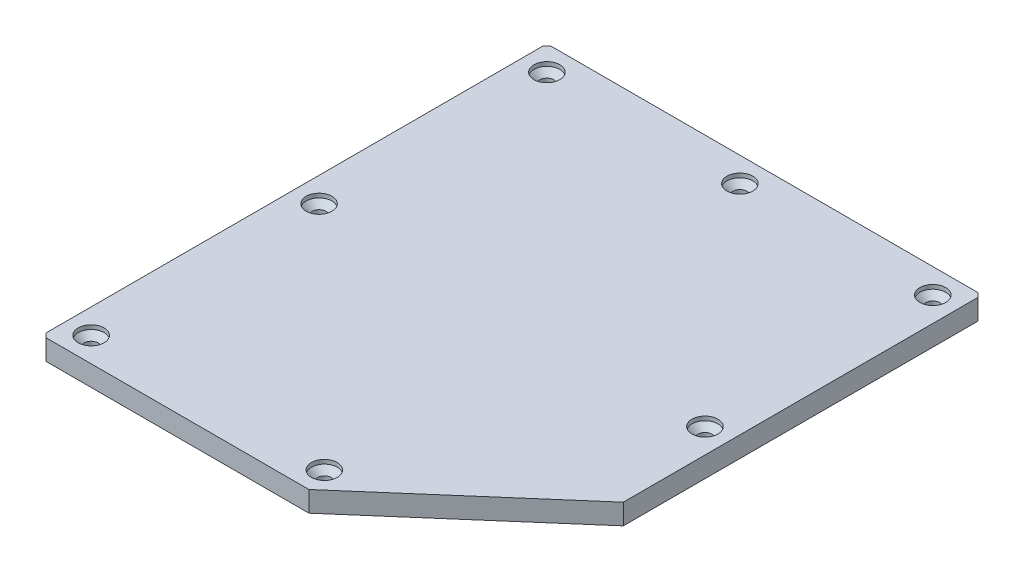
ISO-10303-21;
HEADER;
FILE_DESCRIPTION(('STEP AP214'),'2;1');
FILE_NAME('part.step','',(''),(''),'','','');
FILE_SCHEMA(('AUTOMOTIVE_DESIGN { 1 0 10303 214 1 1 1 1 }'));
ENDSEC;
DATA;
#1=APPLICATION_CONTEXT('core data for automotive mechanical design processes');
#2=APPLICATION_PROTOCOL_DEFINITION('international standard','automotive_design',2000,#1);
#3=PRODUCT_CONTEXT('',#1,'mechanical');
#4=PRODUCT('Part','Part','',(#3));
#5=PRODUCT_RELATED_PRODUCT_CATEGORY('part','',(#4));
#6=PRODUCT_DEFINITION_FORMATION('','',#4);
#7=PRODUCT_DEFINITION_CONTEXT('part definition',#1,'design');
#8=PRODUCT_DEFINITION('design','',#6,#7);
#9=PRODUCT_DEFINITION_SHAPE('','',#8);
#10=(LENGTH_UNIT() NAMED_UNIT(*) SI_UNIT(.MILLI.,.METRE.));
#11=(NAMED_UNIT(*) PLANE_ANGLE_UNIT() SI_UNIT($,.RADIAN.));
#12=(NAMED_UNIT(*) SI_UNIT($,.STERADIAN.) SOLID_ANGLE_UNIT());
#13=UNCERTAINTY_MEASURE_WITH_UNIT(LENGTH_MEASURE(1.E-05),#10,'distance_accuracy_value','');
#14=(GEOMETRIC_REPRESENTATION_CONTEXT(3) GLOBAL_UNCERTAINTY_ASSIGNED_CONTEXT((#13)) GLOBAL_UNIT_ASSIGNED_CONTEXT((#10,
#11,#12)) REPRESENTATION_CONTEXT('',''));
#15=CARTESIAN_POINT('',(0.,0.,0.));
#16=DIRECTION('',(0.,0.,1.));
#17=DIRECTION('',(1.,0.,0.));
#18=AXIS2_PLACEMENT_3D('',#15,#16,#17);
#19=CARTESIAN_POINT('',(12.0405784288172,5.,62.5));
#20=DIRECTION('',(-0.656059028990506,0.,-0.754709580222773));
#21=DIRECTION('',(-0.754709580222773,0.,0.656059028990506));
#22=AXIS2_PLACEMENT_3D('',#19,#20,#21);
#23=PLANE('',#22);
#24=DIRECTION('',(0.754709580222773,0.,-0.656059028990506));
#25=VECTOR('',#24,1.);
#26=CARTESIAN_POINT('',(12.0405784288172,0.,62.5));
#27=LINE('',#26,#25);
#28=CARTESIAN_POINT('',(12.0405784288172,0.,62.5));
#29=VERTEX_POINT('',#28);
#30=CARTESIAN_POINT('',(53.,0.,26.8945180395471));
#31=VERTEX_POINT('',#30);
#32=EDGE_CURVE('E128',#29,#31,#27,.T.);
#33=ORIENTED_EDGE('',*,*,#32,.T.);
#34=DIRECTION('',(0.,-1.,0.));
#35=VECTOR('',#34,1.);
#36=CARTESIAN_POINT('',(53.,5.,26.8945180395471));
#37=LINE('',#36,#35);
#38=CARTESIAN_POINT('',(53.,5.,26.8945180395471));
#39=VERTEX_POINT('',#38);
#40=EDGE_CURVE('E11',#39,#31,#37,.T.);
#41=ORIENTED_EDGE('',*,*,#40,.F.);
#42=DIRECTION('',(0.754709580222773,0.,-0.656059028990506));
#43=VECTOR('',#42,1.);
#44=CARTESIAN_POINT('',(12.0405784288172,5.,62.5));
#45=LINE('',#44,#43);
#46=CARTESIAN_POINT('',(12.0405784288172,5.,62.5));
#47=VERTEX_POINT('',#46);
#48=EDGE_CURVE('E143',#47,#39,#45,.T.);
#49=ORIENTED_EDGE('',*,*,#48,.F.);
#50=DIRECTION('',(0.,-1.,0.));
#51=VECTOR('',#50,1.);
#52=CARTESIAN_POINT('',(12.0405784288172,5.,62.5));
#53=LINE('',#52,#51);
#54=EDGE_CURVE('E124',#47,#29,#53,.T.);
#55=ORIENTED_EDGE('',*,*,#54,.T.);
#56=EDGE_LOOP('',(#33,#41,#49,#55));
#57=FACE_BOUND('',#56,.T.);
#58=ADVANCED_FACE('F32',(#57),#23,.F.);
#59=CARTESIAN_POINT('',(53.,5.,26.8945180395471));
#60=DIRECTION('',(-1.,0.,0.));
#61=DIRECTION('',(0.,0.,1.));
#62=AXIS2_PLACEMENT_3D('',#59,#60,#61);
#63=PLANE('',#62);
#64=DIRECTION('',(0.,0.,-1.));
#65=VECTOR('',#64,1.);
#66=CARTESIAN_POINT('',(53.,0.,26.8945180395471));
#67=LINE('',#66,#65);
#68=CARTESIAN_POINT('',(53.,0.,-59.5));
#69=VERTEX_POINT('',#68);
#70=EDGE_CURVE('E131',#31,#69,#67,.T.);
#71=ORIENTED_EDGE('',*,*,#70,.T.);
#72=DIRECTION('',(0.,-1.,0.));
#73=VECTOR('',#72,1.);
#74=CARTESIAN_POINT('',(53.,5.,-59.5));
#75=LINE('',#74,#73);
#76=CARTESIAN_POINT('',(53.,5.,-59.5));
#77=VERTEX_POINT('',#76);
#78=EDGE_CURVE('E40',#77,#69,#75,.T.);
#79=ORIENTED_EDGE('',*,*,#78,.F.);
#80=DIRECTION('',(0.,0.,-1.));
#81=VECTOR('',#80,1.);
#82=CARTESIAN_POINT('',(53.,5.,26.8945180395471));
#83=LINE('',#82,#81);
#84=EDGE_CURVE('E91',#39,#77,#83,.T.);
#85=ORIENTED_EDGE('',*,*,#84,.F.);
#86=ORIENTED_EDGE('',*,*,#40,.T.);
#87=EDGE_LOOP('',(#71,#79,#85,#86));
#88=FACE_BOUND('',#87,.T.);
#89=ADVANCED_FACE('F296',(#88),#63,.F.);
#90=CARTESIAN_POINT('',(53.,5.,-59.5));
#91=DIRECTION('',(-0.707106781186548,0.,0.707106781186548));
#92=DIRECTION('',(0.707106781186548,0.,0.707106781186548));
#93=AXIS2_PLACEMENT_3D('',#90,#91,#92);
#94=PLANE('',#93);
#95=DIRECTION('',(-0.707106781186547,0.,-0.707106781186547));
#96=VECTOR('',#95,1.);
#97=CARTESIAN_POINT('',(53.,0.,-59.5));
#98=LINE('',#97,#96);
#99=CARTESIAN_POINT('',(52.,0.,-60.5));
#100=VERTEX_POINT('',#99);
#101=EDGE_CURVE('E134',#69,#100,#98,.T.);
#102=ORIENTED_EDGE('',*,*,#101,.T.);
#103=DIRECTION('',(0.,-1.,0.));
#104=VECTOR('',#103,1.);
#105=CARTESIAN_POINT('',(52.,5.,-60.5));
#106=LINE('',#105,#104);
#107=CARTESIAN_POINT('',(52.,5.,-60.5));
#108=VERTEX_POINT('',#107);
#109=EDGE_CURVE('E150',#108,#100,#106,.T.);
#110=ORIENTED_EDGE('',*,*,#109,.F.);
#111=DIRECTION('',(-0.707106781186547,0.,-0.707106781186547));
#112=VECTOR('',#111,1.);
#113=CARTESIAN_POINT('',(53.,5.,-59.5));
#114=LINE('',#113,#112);
#115=EDGE_CURVE('E158',#77,#108,#114,.T.);
#116=ORIENTED_EDGE('',*,*,#115,.F.);
#117=ORIENTED_EDGE('',*,*,#78,.T.);
#118=EDGE_LOOP('',(#102,#110,#116,#117));
#119=FACE_BOUND('',#118,.T.);
#120=ADVANCED_FACE('F156',(#119),#94,.F.);
#121=CARTESIAN_POINT('',(52.,5.,-60.5));
#122=DIRECTION('',(0.,0.,1.));
#123=DIRECTION('',(1.,0.,0.));
#124=AXIS2_PLACEMENT_3D('',#121,#122,#123);
#125=PLANE('',#124);
#126=DIRECTION('',(-1.,0.,0.));
#127=VECTOR('',#126,1.);
#128=CARTESIAN_POINT('',(52.,0.,-60.5));
#129=LINE('',#128,#127);
#130=CARTESIAN_POINT('',(-52.,0.,-60.5));
#131=VERTEX_POINT('',#130);
#132=EDGE_CURVE('E136',#100,#131,#129,.T.);
#133=ORIENTED_EDGE('',*,*,#132,.T.);
#134=DIRECTION('',(0.,-1.,0.));
#135=VECTOR('',#134,1.);
#136=CARTESIAN_POINT('',(-52.,5.,-60.5));
#137=LINE('',#136,#135);
#138=CARTESIAN_POINT('',(-52.,5.,-60.5));
#139=VERTEX_POINT('',#138);
#140=EDGE_CURVE('E147',#139,#131,#137,.T.);
#141=ORIENTED_EDGE('',*,*,#140,.F.);
#142=DIRECTION('',(-1.,0.,0.));
#143=VECTOR('',#142,1.);
#144=CARTESIAN_POINT('',(52.,5.,-60.5));
#145=LINE('',#144,#143);
#146=EDGE_CURVE('E170',#108,#139,#145,.T.);
#147=ORIENTED_EDGE('',*,*,#146,.F.);
#148=ORIENTED_EDGE('',*,*,#109,.T.);
#149=EDGE_LOOP('',(#133,#141,#147,#148));
#150=FACE_BOUND('',#149,.T.);
#151=ADVANCED_FACE('F166',(#150),#125,.F.);
#152=CARTESIAN_POINT('',(-52.,5.,-60.5));
#153=DIRECTION('',(0.707106781186557,0.,0.707106781186538));
#154=DIRECTION('',(0.707106781186538,0.,-0.707106781186557));
#155=AXIS2_PLACEMENT_3D('',#152,#153,#154);
#156=PLANE('',#155);
#157=DIRECTION('',(-0.707106781186538,0.,0.707106781186557));
#158=VECTOR('',#157,1.);
#159=CARTESIAN_POINT('',(-52.,0.,-60.5));
#160=LINE('',#159,#158);
#161=CARTESIAN_POINT('',(-53.,0.,-59.5));
#162=VERTEX_POINT('',#161);
#163=EDGE_CURVE('E138',#131,#162,#160,.T.);
#164=ORIENTED_EDGE('',*,*,#163,.T.);
#165=DIRECTION('',(0.,-1.,0.));
#166=VECTOR('',#165,1.);
#167=CARTESIAN_POINT('',(-53.,5.,-59.5));
#168=LINE('',#167,#166);
#169=CARTESIAN_POINT('',(-53.,5.,-59.5));
#170=VERTEX_POINT('',#169);
#171=EDGE_CURVE('E119',#170,#162,#168,.T.);
#172=ORIENTED_EDGE('',*,*,#171,.F.);
#173=DIRECTION('',(-0.707106781186538,0.,0.707106781186557));
#174=VECTOR('',#173,1.);
#175=CARTESIAN_POINT('',(-52.,5.,-60.5));
#176=LINE('',#175,#174);
#177=EDGE_CURVE('E110',#139,#170,#176,.T.);
#178=ORIENTED_EDGE('',*,*,#177,.F.);
#179=ORIENTED_EDGE('',*,*,#140,.T.);
#180=EDGE_LOOP('',(#164,#172,#178,#179));
#181=FACE_BOUND('',#180,.T.);
#182=ADVANCED_FACE('F169',(#181),#156,.F.);
#183=CARTESIAN_POINT('',(-53.,5.,-59.5));
#184=DIRECTION('',(1.,0.,0.));
#185=DIRECTION('',(0.,0.,-1.));
#186=AXIS2_PLACEMENT_3D('',#183,#184,#185);
#187=PLANE('',#186);
#188=DIRECTION('',(0.,0.,1.));
#189=VECTOR('',#188,1.);
#190=CARTESIAN_POINT('',(-53.,0.,-59.5));
#191=LINE('',#190,#189);
#192=CARTESIAN_POINT('',(-53.,0.,61.5));
#193=VERTEX_POINT('',#192);
#194=EDGE_CURVE('E118',#162,#193,#191,.T.);
#195=ORIENTED_EDGE('',*,*,#194,.T.);
#196=DIRECTION('',(0.,-1.,0.));
#197=VECTOR('',#196,1.);
#198=CARTESIAN_POINT('',(-53.,5.,61.5));
#199=LINE('',#198,#197);
#200=CARTESIAN_POINT('',(-53.,5.,61.5));
#201=VERTEX_POINT('',#200);
#202=EDGE_CURVE('E115',#201,#193,#199,.T.);
#203=ORIENTED_EDGE('',*,*,#202,.F.);
#204=DIRECTION('',(0.,0.,1.));
#205=VECTOR('',#204,1.);
#206=CARTESIAN_POINT('',(-53.,5.,-59.5));
#207=LINE('',#206,#205);
#208=EDGE_CURVE('E104',#170,#201,#207,.T.);
#209=ORIENTED_EDGE('',*,*,#208,.F.);
#210=ORIENTED_EDGE('',*,*,#171,.T.);
#211=EDGE_LOOP('',(#195,#203,#209,#210));
#212=FACE_BOUND('',#211,.T.);
#213=ADVANCED_FACE('F116',(#212),#187,.F.);
#214=CARTESIAN_POINT('',(-53.,5.,61.5));
#215=DIRECTION('',(0.707106781186548,0.,-0.707106781186548));
#216=DIRECTION('',(-0.707106781186548,0.,-0.707106781186548));
#217=AXIS2_PLACEMENT_3D('',#214,#215,#216);
#218=PLANE('',#217);
#219=DIRECTION('',(0.707106781186547,0.,0.707106781186547));
#220=VECTOR('',#219,1.);
#221=CARTESIAN_POINT('',(-53.,0.,61.5));
#222=LINE('',#221,#220);
#223=CARTESIAN_POINT('',(-52.,0.,62.5));
#224=VERTEX_POINT('',#223);
#225=EDGE_CURVE('E77',#193,#224,#222,.T.);
#226=ORIENTED_EDGE('',*,*,#225,.T.);
#227=DIRECTION('',(0.,-1.,0.));
#228=VECTOR('',#227,1.);
#229=CARTESIAN_POINT('',(-52.,5.,62.5));
#230=LINE('',#229,#228);
#231=CARTESIAN_POINT('',(-52.,5.,62.5));
#232=VERTEX_POINT('',#231);
#233=EDGE_CURVE('E120',#232,#224,#230,.T.);
#234=ORIENTED_EDGE('',*,*,#233,.F.);
#235=DIRECTION('',(0.707106781186547,0.,0.707106781186547));
#236=VECTOR('',#235,1.);
#237=CARTESIAN_POINT('',(-53.,5.,61.5));
#238=LINE('',#237,#236);
#239=EDGE_CURVE('E108',#201,#232,#238,.T.);
#240=ORIENTED_EDGE('',*,*,#239,.F.);
#241=ORIENTED_EDGE('',*,*,#202,.T.);
#242=EDGE_LOOP('',(#226,#234,#240,#241));
#243=FACE_BOUND('',#242,.T.);
#244=ADVANCED_FACE('F122',(#243),#218,.F.);
#245=CARTESIAN_POINT('',(-52.,5.,62.5));
#246=DIRECTION('',(0.,0.,-1.));
#247=DIRECTION('',(-1.,0.,0.));
#248=AXIS2_PLACEMENT_3D('',#245,#246,#247);
#249=PLANE('',#248);
#250=DIRECTION('',(1.,0.,0.));
#251=VECTOR('',#250,1.);
#252=CARTESIAN_POINT('',(-52.,0.,62.5));
#253=LINE('',#252,#251);
#254=EDGE_CURVE('E83',#224,#29,#253,.T.);
#255=ORIENTED_EDGE('',*,*,#254,.T.);
#256=ORIENTED_EDGE('',*,*,#54,.F.);
#257=DIRECTION('',(1.,0.,0.));
#258=VECTOR('',#257,1.);
#259=CARTESIAN_POINT('',(-52.,5.,62.5));
#260=LINE('',#259,#258);
#261=EDGE_CURVE('E48',#232,#47,#260,.T.);
#262=ORIENTED_EDGE('',*,*,#261,.F.);
#263=ORIENTED_EDGE('',*,*,#233,.T.);
#264=EDGE_LOOP('',(#255,#256,#262,#263));
#265=FACE_BOUND('',#264,.T.);
#266=ADVANCED_FACE('F264',(#265),#249,.F.);
#267=CARTESIAN_POINT('',(0.,5.,0.));
#268=DIRECTION('',(0.,1.,0.));
#269=DIRECTION('',(0.,0.,1.));
#270=AXIS2_PLACEMENT_3D('',#267,#268,#269);
#271=PLANE('',#270);
#272=CARTESIAN_POINT('',(-47.,5.,-54.5));
#273=DIRECTION('',(0.,1.,0.));
#274=DIRECTION('',(0.,0.,1.));
#275=AXIS2_PLACEMENT_3D('',#272,#273,#274);
#276=CIRCLE('',#275,3.15);
#277=CARTESIAN_POINT('',(-47.,5.,-51.35));
#278=VERTEX_POINT('',#277);
#279=EDGE_CURVE('E256',#278,#278,#276,.T.);
#280=ORIENTED_EDGE('',*,*,#279,.F.);
#281=EDGE_LOOP('',(#280));
#282=FACE_BOUND('',#281,.T.);
#283=CARTESIAN_POINT('',(0.,5.,-54.5));
#284=DIRECTION('',(0.,1.,0.));
#285=DIRECTION('',(0.,0.,1.));
#286=AXIS2_PLACEMENT_3D('',#283,#284,#285);
#287=CIRCLE('',#286,3.15);
#288=CARTESIAN_POINT('',(0.,5.,-51.35));
#289=VERTEX_POINT('',#288);
#290=EDGE_CURVE('E244',#289,#289,#287,.T.);
#291=ORIENTED_EDGE('',*,*,#290,.F.);
#292=EDGE_LOOP('',(#291));
#293=FACE_BOUND('',#292,.T.);
#294=CARTESIAN_POINT('',(47.,5.,-54.5));
#295=DIRECTION('',(0.,1.,0.));
#296=DIRECTION('',(0.,0.,1.));
#297=AXIS2_PLACEMENT_3D('',#294,#295,#296);
#298=CIRCLE('',#297,3.15);
#299=CARTESIAN_POINT('',(47.,5.,-51.35));
#300=VERTEX_POINT('',#299);
#301=EDGE_CURVE('E232',#300,#300,#298,.T.);
#302=ORIENTED_EDGE('',*,*,#301,.F.);
#303=EDGE_LOOP('',(#302));
#304=FACE_BOUND('',#303,.T.);
#305=CARTESIAN_POINT('',(47.,5.,0.999999999999994));
#306=DIRECTION('',(0.,1.,0.));
#307=DIRECTION('',(0.,0.,1.));
#308=AXIS2_PLACEMENT_3D('',#305,#306,#307);
#309=CIRCLE('',#308,3.15);
#310=CARTESIAN_POINT('',(47.,5.,4.14999999999999));
#311=VERTEX_POINT('',#310);
#312=EDGE_CURVE('E220',#311,#311,#309,.T.);
#313=ORIENTED_EDGE('',*,*,#312,.F.);
#314=EDGE_LOOP('',(#313));
#315=FACE_BOUND('',#314,.T.);
#316=CARTESIAN_POINT('',(9.79727035190843,5.,56.5));
#317=DIRECTION('',(0.,1.,0.));
#318=DIRECTION('',(0.,0.,1.));
#319=AXIS2_PLACEMENT_3D('',#316,#317,#318);
#320=CIRCLE('',#319,3.15);
#321=CARTESIAN_POINT('',(9.79727035190843,5.,59.65));
#322=VERTEX_POINT('',#321);
#323=EDGE_CURVE('E208',#322,#322,#320,.T.);
#324=ORIENTED_EDGE('',*,*,#323,.F.);
#325=EDGE_LOOP('',(#324));
#326=FACE_BOUND('',#325,.T.);
#327=CARTESIAN_POINT('',(-47.,5.,56.5));
#328=DIRECTION('',(0.,1.,0.));
#329=DIRECTION('',(0.,0.,1.));
#330=AXIS2_PLACEMENT_3D('',#327,#328,#329);
#331=CIRCLE('',#330,3.15);
#332=CARTESIAN_POINT('',(-47.,5.,59.65));
#333=VERTEX_POINT('',#332);
#334=EDGE_CURVE('E196',#333,#333,#331,.T.);
#335=ORIENTED_EDGE('',*,*,#334,.F.);
#336=EDGE_LOOP('',(#335));
#337=FACE_BOUND('',#336,.T.);
#338=CARTESIAN_POINT('',(-47.,5.,0.999999999999994));
#339=DIRECTION('',(0.,1.,0.));
#340=DIRECTION('',(0.,0.,1.));
#341=AXIS2_PLACEMENT_3D('',#338,#339,#340);
#342=CIRCLE('',#341,3.15);
#343=CARTESIAN_POINT('',(-47.,5.,4.14999999999999));
#344=VERTEX_POINT('',#343);
#345=EDGE_CURVE('E184',#344,#344,#342,.T.);
#346=ORIENTED_EDGE('',*,*,#345,.F.);
#347=EDGE_LOOP('',(#346));
#348=FACE_BOUND('',#347,.T.);
#349=ORIENTED_EDGE('',*,*,#48,.T.);
#350=ORIENTED_EDGE('',*,*,#84,.T.);
#351=ORIENTED_EDGE('',*,*,#115,.T.);
#352=ORIENTED_EDGE('',*,*,#146,.T.);
#353=ORIENTED_EDGE('',*,*,#177,.T.);
#354=ORIENTED_EDGE('',*,*,#208,.T.);
#355=ORIENTED_EDGE('',*,*,#239,.T.);
#356=ORIENTED_EDGE('',*,*,#261,.T.);
#357=EDGE_LOOP('',(#349,#350,#351,#352,#353,#354,#355,#356));
#358=FACE_BOUND('',#357,.T.);
#359=ADVANCED_FACE('F106',(#282,#293,#304,#315,#326,#337,#348,#358),#271,.T.);
#360=CARTESIAN_POINT('',(0.,0.,0.));
#361=DIRECTION('',(0.,1.,0.));
#362=DIRECTION('',(0.,0.,1.));
#363=AXIS2_PLACEMENT_3D('',#360,#361,#362);
#364=PLANE('',#363);
#365=CARTESIAN_POINT('',(-47.,0.,-54.5));
#366=DIRECTION('',(0.,1.,0.));
#367=DIRECTION('',(0.,0.,1.));
#368=AXIS2_PLACEMENT_3D('',#365,#366,#367);
#369=CIRCLE('',#368,1.70000000000001);
#370=CARTESIAN_POINT('',(-47.,0.,-52.8));
#371=VERTEX_POINT('',#370);
#372=EDGE_CURVE('E247',#371,#371,#369,.T.);
#373=ORIENTED_EDGE('',*,*,#372,.T.);
#374=EDGE_LOOP('',(#373));
#375=FACE_BOUND('',#374,.T.);
#376=CARTESIAN_POINT('',(0.,0.,-54.5));
#377=DIRECTION('',(0.,1.,0.));
#378=DIRECTION('',(0.,0.,1.));
#379=AXIS2_PLACEMENT_3D('',#376,#377,#378);
#380=CIRCLE('',#379,1.70000000000001);
#381=CARTESIAN_POINT('',(0.,0.,-52.8));
#382=VERTEX_POINT('',#381);
#383=EDGE_CURVE('E235',#382,#382,#380,.T.);
#384=ORIENTED_EDGE('',*,*,#383,.T.);
#385=EDGE_LOOP('',(#384));
#386=FACE_BOUND('',#385,.T.);
#387=CARTESIAN_POINT('',(47.,0.,-54.5));
#388=DIRECTION('',(0.,1.,0.));
#389=DIRECTION('',(0.,0.,1.));
#390=AXIS2_PLACEMENT_3D('',#387,#388,#389);
#391=CIRCLE('',#390,1.70000000000001);
#392=CARTESIAN_POINT('',(47.,0.,-52.8));
#393=VERTEX_POINT('',#392);
#394=EDGE_CURVE('E223',#393,#393,#391,.T.);
#395=ORIENTED_EDGE('',*,*,#394,.T.);
#396=EDGE_LOOP('',(#395));
#397=FACE_BOUND('',#396,.T.);
#398=CARTESIAN_POINT('',(47.,0.,0.999999999999994));
#399=DIRECTION('',(0.,1.,0.));
#400=DIRECTION('',(0.,0.,1.));
#401=AXIS2_PLACEMENT_3D('',#398,#399,#400);
#402=CIRCLE('',#401,1.70000000000001);
#403=CARTESIAN_POINT('',(47.,0.,2.7));
#404=VERTEX_POINT('',#403);
#405=EDGE_CURVE('E211',#404,#404,#402,.T.);
#406=ORIENTED_EDGE('',*,*,#405,.T.);
#407=EDGE_LOOP('',(#406));
#408=FACE_BOUND('',#407,.T.);
#409=CARTESIAN_POINT('',(9.79727035190843,0.,56.5));
#410=DIRECTION('',(0.,1.,0.));
#411=DIRECTION('',(0.,0.,1.));
#412=AXIS2_PLACEMENT_3D('',#409,#410,#411);
#413=CIRCLE('',#412,1.70000000000001);
#414=CARTESIAN_POINT('',(9.79727035190843,0.,58.2));
#415=VERTEX_POINT('',#414);
#416=EDGE_CURVE('E199',#415,#415,#413,.T.);
#417=ORIENTED_EDGE('',*,*,#416,.T.);
#418=EDGE_LOOP('',(#417));
#419=FACE_BOUND('',#418,.T.);
#420=CARTESIAN_POINT('',(-47.,0.,56.5));
#421=DIRECTION('',(0.,1.,0.));
#422=DIRECTION('',(0.,0.,1.));
#423=AXIS2_PLACEMENT_3D('',#420,#421,#422);
#424=CIRCLE('',#423,1.70000000000001);
#425=CARTESIAN_POINT('',(-47.,0.,58.2));
#426=VERTEX_POINT('',#425);
#427=EDGE_CURVE('E187',#426,#426,#424,.T.);
#428=ORIENTED_EDGE('',*,*,#427,.T.);
#429=EDGE_LOOP('',(#428));
#430=FACE_BOUND('',#429,.T.);
#431=CARTESIAN_POINT('',(-47.,0.,0.999999999999994));
#432=DIRECTION('',(0.,1.,0.));
#433=DIRECTION('',(0.,0.,1.));
#434=AXIS2_PLACEMENT_3D('',#431,#432,#433);
#435=CIRCLE('',#434,1.70000000000001);
#436=CARTESIAN_POINT('',(-47.,0.,2.7));
#437=VERTEX_POINT('',#436);
#438=EDGE_CURVE('E132',#437,#437,#435,.T.);
#439=ORIENTED_EDGE('',*,*,#438,.T.);
#440=EDGE_LOOP('',(#439));
#441=FACE_BOUND('',#440,.T.);
#442=ORIENTED_EDGE('',*,*,#32,.F.);
#443=ORIENTED_EDGE('',*,*,#254,.F.);
#444=ORIENTED_EDGE('',*,*,#225,.F.);
#445=ORIENTED_EDGE('',*,*,#194,.F.);
#446=ORIENTED_EDGE('',*,*,#163,.F.);
#447=ORIENTED_EDGE('',*,*,#132,.F.);
#448=ORIENTED_EDGE('',*,*,#101,.F.);
#449=ORIENTED_EDGE('',*,*,#70,.F.);
#450=EDGE_LOOP('',(#442,#443,#444,#445,#446,#447,#448,#449));
#451=FACE_BOUND('',#450,.T.);
#452=ADVANCED_FACE('F162',(#375,#386,#397,#408,#419,#430,#441,#451),#364,.F.);
#453=CARTESIAN_POINT('',(-47.,5.,0.999999999999994));
#454=DIRECTION('',(0.,1.,0.));
#455=DIRECTION('',(0.,0.,1.));
#456=AXIS2_PLACEMENT_3D('',#453,#454,#455);
#457=CYLINDRICAL_SURFACE('',#456,1.7);
#458=ORIENTED_EDGE('',*,*,#438,.F.);
#459=EDGE_LOOP('',(#458));
#460=FACE_BOUND('',#459,.T.);
#461=CARTESIAN_POINT('',(-47.,2.55000000000038,0.999999999999994));
#462=DIRECTION('',(0.,1.,0.));
#463=DIRECTION('',(0.,0.,1.));
#464=AXIS2_PLACEMENT_3D('',#461,#462,#463);
#465=CIRCLE('',#464,1.7);
#466=CARTESIAN_POINT('',(-47.,2.55000000000038,2.69999999999999));
#467=VERTEX_POINT('',#466);
#468=EDGE_CURVE('E178',#467,#467,#465,.T.);
#469=ORIENTED_EDGE('',*,*,#468,.T.);
#470=EDGE_LOOP('',(#469));
#471=FACE_BOUND('',#470,.T.);
#472=ADVANCED_FACE('F291',(#460,#471),#457,.F.);
#473=CARTESIAN_POINT('',(-47.,4.00000000000011,0.999999999999994));
#474=DIRECTION('',(0.,1.,0.));
#475=DIRECTION('',(0.,0.,1.));
#476=AXIS2_PLACEMENT_3D('',#473,#474,#475);
#477=CONICAL_SURFACE('',#476,3.14999999999975,0.785398163397455);
#478=ORIENTED_EDGE('',*,*,#468,.F.);
#479=EDGE_LOOP('',(#478));
#480=FACE_BOUND('',#479,.T.);
#481=CARTESIAN_POINT('',(-47.,4.00000000000011,0.999999999999994));
#482=DIRECTION('',(0.,1.,0.));
#483=DIRECTION('',(0.,0.,1.));
#484=AXIS2_PLACEMENT_3D('',#481,#482,#483);
#485=CIRCLE('',#484,3.14999999999975);
#486=CARTESIAN_POINT('',(-47.,4.00000000000011,4.14999999999974));
#487=VERTEX_POINT('',#486);
#488=EDGE_CURVE('E181',#487,#487,#485,.T.);
#489=ORIENTED_EDGE('',*,*,#488,.T.);
#490=EDGE_LOOP('',(#489));
#491=FACE_BOUND('',#490,.T.);
#492=ADVANCED_FACE('F281',(#480,#491),#477,.F.);
#493=CARTESIAN_POINT('',(-47.,5.,0.999999999999994));
#494=DIRECTION('',(0.,1.,0.));
#495=DIRECTION('',(0.,0.,1.));
#496=AXIS2_PLACEMENT_3D('',#493,#494,#495);
#497=CYLINDRICAL_SURFACE('',#496,3.14999999999988);
#498=ORIENTED_EDGE('',*,*,#488,.F.);
#499=EDGE_LOOP('',(#498));
#500=FACE_BOUND('',#499,.T.);
#501=ORIENTED_EDGE('',*,*,#345,.T.);
#502=EDGE_LOOP('',(#501));
#503=FACE_BOUND('',#502,.T.);
#504=ADVANCED_FACE('F278',(#500,#503),#497,.F.);
#505=CARTESIAN_POINT('',(-47.,5.,56.5));
#506=DIRECTION('',(0.,1.,0.));
#507=DIRECTION('',(0.,0.,1.));
#508=AXIS2_PLACEMENT_3D('',#505,#506,#507);
#509=CYLINDRICAL_SURFACE('',#508,1.70000000000001);
#510=ORIENTED_EDGE('',*,*,#427,.F.);
#511=EDGE_LOOP('',(#510));
#512=FACE_BOUND('',#511,.T.);
#513=CARTESIAN_POINT('',(-47.,2.55000000000038,56.5));
#514=DIRECTION('',(0.,1.,0.));
#515=DIRECTION('',(0.,0.,1.));
#516=AXIS2_PLACEMENT_3D('',#513,#514,#515);
#517=CIRCLE('',#516,1.7);
#518=CARTESIAN_POINT('',(-47.,2.55000000000038,58.2));
#519=VERTEX_POINT('',#518);
#520=EDGE_CURVE('E190',#519,#519,#517,.T.);
#521=ORIENTED_EDGE('',*,*,#520,.T.);
#522=EDGE_LOOP('',(#521));
#523=FACE_BOUND('',#522,.T.);
#524=ADVANCED_FACE('F280',(#512,#523),#509,.F.);
#525=CARTESIAN_POINT('',(-47.,4.00000000000011,56.5));
#526=DIRECTION('',(0.,1.,0.));
#527=DIRECTION('',(0.,0.,1.));
#528=AXIS2_PLACEMENT_3D('',#525,#526,#527);
#529=CONICAL_SURFACE('',#528,3.14999999999975,0.785398163397455);
#530=ORIENTED_EDGE('',*,*,#520,.F.);
#531=EDGE_LOOP('',(#530));
#532=FACE_BOUND('',#531,.T.);
#533=CARTESIAN_POINT('',(-47.,4.00000000000011,56.5));
#534=DIRECTION('',(0.,1.,0.));
#535=DIRECTION('',(0.,0.,1.));
#536=AXIS2_PLACEMENT_3D('',#533,#534,#535);
#537=CIRCLE('',#536,3.14999999999975);
#538=CARTESIAN_POINT('',(-47.,4.00000000000011,59.6499999999997));
#539=VERTEX_POINT('',#538);
#540=EDGE_CURVE('E193',#539,#539,#537,.T.);
#541=ORIENTED_EDGE('',*,*,#540,.T.);
#542=EDGE_LOOP('',(#541));
#543=FACE_BOUND('',#542,.T.);
#544=ADVANCED_FACE('F288',(#532,#543),#529,.F.);
#545=CARTESIAN_POINT('',(-47.,5.,56.5));
#546=DIRECTION('',(0.,1.,0.));
#547=DIRECTION('',(0.,0.,1.));
#548=AXIS2_PLACEMENT_3D('',#545,#546,#547);
#549=CYLINDRICAL_SURFACE('',#548,3.14999999999988);
#550=ORIENTED_EDGE('',*,*,#540,.F.);
#551=EDGE_LOOP('',(#550));
#552=FACE_BOUND('',#551,.T.);
#553=ORIENTED_EDGE('',*,*,#334,.T.);
#554=EDGE_LOOP('',(#553));
#555=FACE_BOUND('',#554,.T.);
#556=ADVANCED_FACE('F390',(#552,#555),#549,.F.);
#557=CARTESIAN_POINT('',(9.79727035190843,5.,56.5));
#558=DIRECTION('',(0.,1.,0.));
#559=DIRECTION('',(0.,0.,1.));
#560=AXIS2_PLACEMENT_3D('',#557,#558,#559);
#561=CYLINDRICAL_SURFACE('',#560,1.7);
#562=ORIENTED_EDGE('',*,*,#416,.F.);
#563=EDGE_LOOP('',(#562));
#564=FACE_BOUND('',#563,.T.);
#565=CARTESIAN_POINT('',(9.79727035190843,2.55000000000038,56.5));
#566=DIRECTION('',(0.,1.,0.));
#567=DIRECTION('',(0.,0.,1.));
#568=AXIS2_PLACEMENT_3D('',#565,#566,#567);
#569=CIRCLE('',#568,1.7);
#570=CARTESIAN_POINT('',(9.79727035190843,2.55000000000038,58.2));
#571=VERTEX_POINT('',#570);
#572=EDGE_CURVE('E202',#571,#571,#569,.T.);
#573=ORIENTED_EDGE('',*,*,#572,.T.);
#574=EDGE_LOOP('',(#573));
#575=FACE_BOUND('',#574,.T.);
#576=ADVANCED_FACE('F400',(#564,#575),#561,.F.);
#577=CARTESIAN_POINT('',(9.79727035190843,4.00000000000011,56.5));
#578=DIRECTION('',(0.,1.,0.));
#579=DIRECTION('',(0.,0.,1.));
#580=AXIS2_PLACEMENT_3D('',#577,#578,#579);
#581=CONICAL_SURFACE('',#580,3.14999999999975,0.785398163397455);
#582=ORIENTED_EDGE('',*,*,#572,.F.);
#583=EDGE_LOOP('',(#582));
#584=FACE_BOUND('',#583,.T.);
#585=CARTESIAN_POINT('',(9.79727035190843,4.00000000000011,56.5));
#586=DIRECTION('',(0.,1.,0.));
#587=DIRECTION('',(0.,0.,1.));
#588=AXIS2_PLACEMENT_3D('',#585,#586,#587);
#589=CIRCLE('',#588,3.14999999999975);
#590=CARTESIAN_POINT('',(9.79727035190843,4.00000000000011,59.6499999999997));
#591=VERTEX_POINT('',#590);
#592=EDGE_CURVE('E205',#591,#591,#589,.T.);
#593=ORIENTED_EDGE('',*,*,#592,.T.);
#594=EDGE_LOOP('',(#593));
#595=FACE_BOUND('',#594,.T.);
#596=ADVANCED_FACE('F410',(#584,#595),#581,.F.);
#597=CARTESIAN_POINT('',(9.79727035190843,5.,56.5));
#598=DIRECTION('',(0.,1.,0.));
#599=DIRECTION('',(0.,0.,1.));
#600=AXIS2_PLACEMENT_3D('',#597,#598,#599);
#601=CYLINDRICAL_SURFACE('',#600,3.14999999999987);
#602=ORIENTED_EDGE('',*,*,#592,.F.);
#603=EDGE_LOOP('',(#602));
#604=FACE_BOUND('',#603,.T.);
#605=ORIENTED_EDGE('',*,*,#323,.T.);
#606=EDGE_LOOP('',(#605));
#607=FACE_BOUND('',#606,.T.);
#608=ADVANCED_FACE('F420',(#604,#607),#601,.F.);
#609=CARTESIAN_POINT('',(47.,5.,0.999999999999994));
#610=DIRECTION('',(0.,1.,0.));
#611=DIRECTION('',(0.,0.,1.));
#612=AXIS2_PLACEMENT_3D('',#609,#610,#611);
#613=CYLINDRICAL_SURFACE('',#612,1.7);
#614=ORIENTED_EDGE('',*,*,#405,.F.);
#615=EDGE_LOOP('',(#614));
#616=FACE_BOUND('',#615,.T.);
#617=CARTESIAN_POINT('',(47.,2.55000000000038,0.999999999999994));
#618=DIRECTION('',(0.,1.,0.));
#619=DIRECTION('',(0.,0.,1.));
#620=AXIS2_PLACEMENT_3D('',#617,#618,#619);
#621=CIRCLE('',#620,1.7);
#622=CARTESIAN_POINT('',(47.,2.55000000000038,2.69999999999999));
#623=VERTEX_POINT('',#622);
#624=EDGE_CURVE('E214',#623,#623,#621,.T.);
#625=ORIENTED_EDGE('',*,*,#624,.T.);
#626=EDGE_LOOP('',(#625));
#627=FACE_BOUND('',#626,.T.);
#628=ADVANCED_FACE('F430',(#616,#627),#613,.F.);
#629=CARTESIAN_POINT('',(47.,4.00000000000011,0.999999999999994));
#630=DIRECTION('',(0.,1.,0.));
#631=DIRECTION('',(0.,0.,1.));
#632=AXIS2_PLACEMENT_3D('',#629,#630,#631);
#633=CONICAL_SURFACE('',#632,3.14999999999975,0.785398163397455);
#634=ORIENTED_EDGE('',*,*,#624,.F.);
#635=EDGE_LOOP('',(#634));
#636=FACE_BOUND('',#635,.T.);
#637=CARTESIAN_POINT('',(47.,4.00000000000011,0.999999999999994));
#638=DIRECTION('',(0.,1.,0.));
#639=DIRECTION('',(0.,0.,1.));
#640=AXIS2_PLACEMENT_3D('',#637,#638,#639);
#641=CIRCLE('',#640,3.14999999999975);
#642=CARTESIAN_POINT('',(47.,4.00000000000011,4.14999999999974));
#643=VERTEX_POINT('',#642);
#644=EDGE_CURVE('E217',#643,#643,#641,.T.);
#645=ORIENTED_EDGE('',*,*,#644,.T.);
#646=EDGE_LOOP('',(#645));
#647=FACE_BOUND('',#646,.T.);
#648=ADVANCED_FACE('F440',(#636,#647),#633,.F.);
#649=CARTESIAN_POINT('',(47.,5.,0.999999999999994));
#650=DIRECTION('',(0.,1.,0.));
#651=DIRECTION('',(0.,0.,1.));
#652=AXIS2_PLACEMENT_3D('',#649,#650,#651);
#653=CYLINDRICAL_SURFACE('',#652,3.14999999999988);
#654=ORIENTED_EDGE('',*,*,#644,.F.);
#655=EDGE_LOOP('',(#654));
#656=FACE_BOUND('',#655,.T.);
#657=ORIENTED_EDGE('',*,*,#312,.T.);
#658=EDGE_LOOP('',(#657));
#659=FACE_BOUND('',#658,.T.);
#660=ADVANCED_FACE('F450',(#656,#659),#653,.F.);
#661=CARTESIAN_POINT('',(47.,5.,-54.5));
#662=DIRECTION('',(0.,1.,0.));
#663=DIRECTION('',(0.,0.,1.));
#664=AXIS2_PLACEMENT_3D('',#661,#662,#663);
#665=CYLINDRICAL_SURFACE('',#664,1.70000000000001);
#666=ORIENTED_EDGE('',*,*,#394,.F.);
#667=EDGE_LOOP('',(#666));
#668=FACE_BOUND('',#667,.T.);
#669=CARTESIAN_POINT('',(47.,2.55000000000038,-54.5));
#670=DIRECTION('',(0.,1.,0.));
#671=DIRECTION('',(0.,0.,1.));
#672=AXIS2_PLACEMENT_3D('',#669,#670,#671);
#673=CIRCLE('',#672,1.7);
#674=CARTESIAN_POINT('',(47.,2.55000000000038,-52.8));
#675=VERTEX_POINT('',#674);
#676=EDGE_CURVE('E226',#675,#675,#673,.T.);
#677=ORIENTED_EDGE('',*,*,#676,.T.);
#678=EDGE_LOOP('',(#677));
#679=FACE_BOUND('',#678,.T.);
#680=ADVANCED_FACE('F460',(#668,#679),#665,.F.);
#681=CARTESIAN_POINT('',(47.,4.00000000000011,-54.5));
#682=DIRECTION('',(0.,1.,0.));
#683=DIRECTION('',(0.,0.,1.));
#684=AXIS2_PLACEMENT_3D('',#681,#682,#683);
#685=CONICAL_SURFACE('',#684,3.14999999999975,0.785398163397455);
#686=ORIENTED_EDGE('',*,*,#676,.F.);
#687=EDGE_LOOP('',(#686));
#688=FACE_BOUND('',#687,.T.);
#689=CARTESIAN_POINT('',(47.,4.00000000000011,-54.5));
#690=DIRECTION('',(0.,1.,0.));
#691=DIRECTION('',(0.,0.,1.));
#692=AXIS2_PLACEMENT_3D('',#689,#690,#691);
#693=CIRCLE('',#692,3.14999999999975);
#694=CARTESIAN_POINT('',(47.,4.00000000000011,-51.3500000000003));
#695=VERTEX_POINT('',#694);
#696=EDGE_CURVE('E229',#695,#695,#693,.T.);
#697=ORIENTED_EDGE('',*,*,#696,.T.);
#698=EDGE_LOOP('',(#697));
#699=FACE_BOUND('',#698,.T.);
#700=ADVANCED_FACE('F470',(#688,#699),#685,.F.);
#701=CARTESIAN_POINT('',(47.,5.,-54.5));
#702=DIRECTION('',(0.,1.,0.));
#703=DIRECTION('',(0.,0.,1.));
#704=AXIS2_PLACEMENT_3D('',#701,#702,#703);
#705=CYLINDRICAL_SURFACE('',#704,3.14999999999988);
#706=ORIENTED_EDGE('',*,*,#696,.F.);
#707=EDGE_LOOP('',(#706));
#708=FACE_BOUND('',#707,.T.);
#709=ORIENTED_EDGE('',*,*,#301,.T.);
#710=EDGE_LOOP('',(#709));
#711=FACE_BOUND('',#710,.T.);
#712=ADVANCED_FACE('F480',(#708,#711),#705,.F.);
#713=CARTESIAN_POINT('',(0.,5.,-54.5));
#714=DIRECTION('',(0.,1.,0.));
#715=DIRECTION('',(0.,0.,1.));
#716=AXIS2_PLACEMENT_3D('',#713,#714,#715);
#717=CYLINDRICAL_SURFACE('',#716,1.7);
#718=ORIENTED_EDGE('',*,*,#383,.F.);
#719=EDGE_LOOP('',(#718));
#720=FACE_BOUND('',#719,.T.);
#721=CARTESIAN_POINT('',(0.,2.55000000000038,-54.5));
#722=DIRECTION('',(0.,1.,0.));
#723=DIRECTION('',(0.,0.,1.));
#724=AXIS2_PLACEMENT_3D('',#721,#722,#723);
#725=CIRCLE('',#724,1.7);
#726=CARTESIAN_POINT('',(0.,2.55000000000038,-52.8));
#727=VERTEX_POINT('',#726);
#728=EDGE_CURVE('E238',#727,#727,#725,.T.);
#729=ORIENTED_EDGE('',*,*,#728,.T.);
#730=EDGE_LOOP('',(#729));
#731=FACE_BOUND('',#730,.T.);
#732=ADVANCED_FACE('F490',(#720,#731),#717,.F.);
#733=CARTESIAN_POINT('',(0.,4.00000000000011,-54.5));
#734=DIRECTION('',(0.,1.,0.));
#735=DIRECTION('',(0.,0.,1.));
#736=AXIS2_PLACEMENT_3D('',#733,#734,#735);
#737=CONICAL_SURFACE('',#736,3.14999999999975,0.785398163397455);
#738=ORIENTED_EDGE('',*,*,#728,.F.);
#739=EDGE_LOOP('',(#738));
#740=FACE_BOUND('',#739,.T.);
#741=CARTESIAN_POINT('',(0.,4.00000000000011,-54.5));
#742=DIRECTION('',(0.,1.,0.));
#743=DIRECTION('',(0.,0.,1.));
#744=AXIS2_PLACEMENT_3D('',#741,#742,#743);
#745=CIRCLE('',#744,3.14999999999975);
#746=CARTESIAN_POINT('',(0.,4.00000000000011,-51.3500000000003));
#747=VERTEX_POINT('',#746);
#748=EDGE_CURVE('E241',#747,#747,#745,.T.);
#749=ORIENTED_EDGE('',*,*,#748,.T.);
#750=EDGE_LOOP('',(#749));
#751=FACE_BOUND('',#750,.T.);
#752=ADVANCED_FACE('F500',(#740,#751),#737,.F.);
#753=CARTESIAN_POINT('',(0.,5.,-54.5));
#754=DIRECTION('',(0.,1.,0.));
#755=DIRECTION('',(0.,0.,1.));
#756=AXIS2_PLACEMENT_3D('',#753,#754,#755);
#757=CYLINDRICAL_SURFACE('',#756,3.14999999999987);
#758=ORIENTED_EDGE('',*,*,#748,.F.);
#759=EDGE_LOOP('',(#758));
#760=FACE_BOUND('',#759,.T.);
#761=ORIENTED_EDGE('',*,*,#290,.T.);
#762=EDGE_LOOP('',(#761));
#763=FACE_BOUND('',#762,.T.);
#764=ADVANCED_FACE('F510',(#760,#763),#757,.F.);
#765=CARTESIAN_POINT('',(-47.,5.,-54.5));
#766=DIRECTION('',(0.,1.,0.));
#767=DIRECTION('',(0.,0.,1.));
#768=AXIS2_PLACEMENT_3D('',#765,#766,#767);
#769=CYLINDRICAL_SURFACE('',#768,1.70000000000001);
#770=ORIENTED_EDGE('',*,*,#372,.F.);
#771=EDGE_LOOP('',(#770));
#772=FACE_BOUND('',#771,.T.);
#773=CARTESIAN_POINT('',(-47.,2.55000000000038,-54.5));
#774=DIRECTION('',(0.,1.,0.));
#775=DIRECTION('',(0.,0.,1.));
#776=AXIS2_PLACEMENT_3D('',#773,#774,#775);
#777=CIRCLE('',#776,1.7);
#778=CARTESIAN_POINT('',(-47.,2.55000000000038,-52.8));
#779=VERTEX_POINT('',#778);
#780=EDGE_CURVE('E250',#779,#779,#777,.T.);
#781=ORIENTED_EDGE('',*,*,#780,.T.);
#782=EDGE_LOOP('',(#781));
#783=FACE_BOUND('',#782,.T.);
#784=ADVANCED_FACE('F520',(#772,#783),#769,.F.);
#785=CARTESIAN_POINT('',(-47.,4.00000000000011,-54.5));
#786=DIRECTION('',(0.,1.,0.));
#787=DIRECTION('',(0.,0.,1.));
#788=AXIS2_PLACEMENT_3D('',#785,#786,#787);
#789=CONICAL_SURFACE('',#788,3.14999999999975,0.785398163397455);
#790=ORIENTED_EDGE('',*,*,#780,.F.);
#791=EDGE_LOOP('',(#790));
#792=FACE_BOUND('',#791,.T.);
#793=CARTESIAN_POINT('',(-47.,4.00000000000011,-54.5));
#794=DIRECTION('',(0.,1.,0.));
#795=DIRECTION('',(0.,0.,1.));
#796=AXIS2_PLACEMENT_3D('',#793,#794,#795);
#797=CIRCLE('',#796,3.14999999999975);
#798=CARTESIAN_POINT('',(-47.,4.00000000000011,-51.3500000000003));
#799=VERTEX_POINT('',#798);
#800=EDGE_CURVE('E253',#799,#799,#797,.T.);
#801=ORIENTED_EDGE('',*,*,#800,.T.);
#802=EDGE_LOOP('',(#801));
#803=FACE_BOUND('',#802,.T.);
#804=ADVANCED_FACE('F530',(#792,#803),#789,.F.);
#805=CARTESIAN_POINT('',(-47.,5.,-54.5));
#806=DIRECTION('',(0.,1.,0.));
#807=DIRECTION('',(0.,0.,1.));
#808=AXIS2_PLACEMENT_3D('',#805,#806,#807);
#809=CYLINDRICAL_SURFACE('',#808,3.14999999999988);
#810=ORIENTED_EDGE('',*,*,#800,.F.);
#811=EDGE_LOOP('',(#810));
#812=FACE_BOUND('',#811,.T.);
#813=ORIENTED_EDGE('',*,*,#279,.T.);
#814=EDGE_LOOP('',(#813));
#815=FACE_BOUND('',#814,.T.);
#816=ADVANCED_FACE('F260',(#812,#815),#809,.F.);
#817=CLOSED_SHELL('',(#58,#89,#120,#151,#182,#213,#244,#266,#359,#452,#472,#492,#504,#524,#544,
#556,#576,#596,#608,#628,#648,#660,#680,#700,#712,#732,#752,#764,#784,#804,#816));
#818=MANIFOLD_SOLID_BREP('B2',#817);
#819=ADVANCED_BREP_SHAPE_REPRESENTATION('',(#18,#818),#14);
#820=SHAPE_DEFINITION_REPRESENTATION(#9,#819);
ENDSEC;
END-ISO-10303-21;
